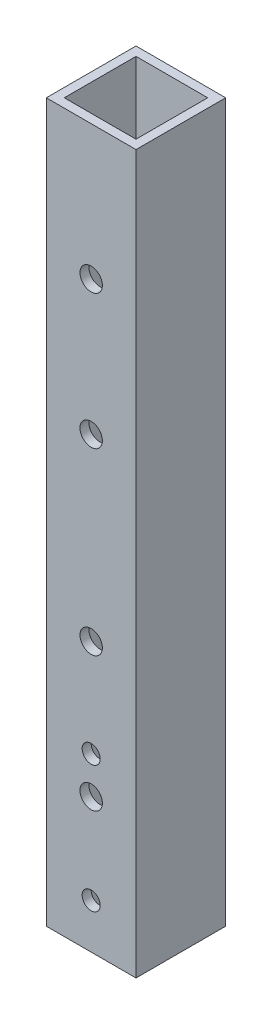
ISO-10303-21;
HEADER;
FILE_DESCRIPTION(('STEP AP214'),'2;1');
FILE_NAME('part.step','',(''),(''),'','','');
FILE_SCHEMA(('AUTOMOTIVE_DESIGN { 1 0 10303 214 1 1 1 1 }'));
ENDSEC;
DATA;
#1=APPLICATION_CONTEXT('core data for automotive mechanical design processes');
#2=APPLICATION_PROTOCOL_DEFINITION('international standard','automotive_design',2000,#1);
#3=PRODUCT_CONTEXT('',#1,'mechanical');
#4=PRODUCT('Part','Part','',(#3));
#5=PRODUCT_RELATED_PRODUCT_CATEGORY('part','',(#4));
#6=PRODUCT_DEFINITION_FORMATION('','',#4);
#7=PRODUCT_DEFINITION_CONTEXT('part definition',#1,'design');
#8=PRODUCT_DEFINITION('design','',#6,#7);
#9=PRODUCT_DEFINITION_SHAPE('','',#8);
#10=(LENGTH_UNIT() NAMED_UNIT(*) SI_UNIT(.MILLI.,.METRE.));
#11=(NAMED_UNIT(*) PLANE_ANGLE_UNIT() SI_UNIT($,.RADIAN.));
#12=(NAMED_UNIT(*) SI_UNIT($,.STERADIAN.) SOLID_ANGLE_UNIT());
#13=UNCERTAINTY_MEASURE_WITH_UNIT(LENGTH_MEASURE(1.E-05),#10,'distance_accuracy_value','');
#14=(GEOMETRIC_REPRESENTATION_CONTEXT(3) GLOBAL_UNCERTAINTY_ASSIGNED_CONTEXT((#13)) GLOBAL_UNIT_ASSIGNED_CONTEXT((#10,
#11,#12)) REPRESENTATION_CONTEXT('',''));
#15=CARTESIAN_POINT('',(0.,0.,0.));
#16=DIRECTION('',(0.,0.,1.));
#17=DIRECTION('',(1.,0.,0.));
#18=AXIS2_PLACEMENT_3D('',#15,#16,#17);
#19=CARTESIAN_POINT('',(0.,101.6,0.));
#20=DIRECTION('',(0.,1.,0.));
#21=DIRECTION('',(0.,0.,1.));
#22=AXIS2_PLACEMENT_3D('',#19,#20,#21);
#23=PLANE('',#22);
#24=DIRECTION('',(0.,0.,-1.));
#25=VECTOR('',#24,1.);
#26=CARTESIAN_POINT('',(12.7,101.6,-12.7));
#27=LINE('',#26,#25);
#28=CARTESIAN_POINT('',(12.7,101.6,12.7));
#29=VERTEX_POINT('',#28);
#30=CARTESIAN_POINT('',(12.7,101.6,-12.7));
#31=VERTEX_POINT('',#30);
#32=EDGE_CURVE('E160',#29,#31,#27,.T.);
#33=ORIENTED_EDGE('',*,*,#32,.T.);
#34=DIRECTION('',(-1.,0.,0.));
#35=VECTOR('',#34,1.);
#36=CARTESIAN_POINT('',(-12.7,101.6,-12.7));
#37=LINE('',#36,#35);
#38=CARTESIAN_POINT('',(-12.7,101.6,-12.7));
#39=VERTEX_POINT('',#38);
#40=EDGE_CURVE('E164',#31,#39,#37,.T.);
#41=ORIENTED_EDGE('',*,*,#40,.T.);
#42=DIRECTION('',(0.,0.,1.));
#43=VECTOR('',#42,1.);
#44=CARTESIAN_POINT('',(-12.7,101.6,-12.7));
#45=LINE('',#44,#43);
#46=CARTESIAN_POINT('',(-12.7,101.6,12.7));
#47=VERTEX_POINT('',#46);
#48=EDGE_CURVE('E168',#39,#47,#45,.T.);
#49=ORIENTED_EDGE('',*,*,#48,.T.);
#50=DIRECTION('',(1.,0.,0.));
#51=VECTOR('',#50,1.);
#52=CARTESIAN_POINT('',(-12.7,101.6,12.7));
#53=LINE('',#52,#51);
#54=EDGE_CURVE('E171',#47,#29,#53,.T.);
#55=ORIENTED_EDGE('',*,*,#54,.T.);
#56=EDGE_LOOP('',(#33,#41,#49,#55));
#57=FACE_BOUND('',#56,.T.);
#58=DIRECTION('',(-1.,0.,0.));
#59=VECTOR('',#58,1.);
#60=CARTESIAN_POINT('',(-10.16,101.6,-10.16));
#61=LINE('',#60,#59);
#62=CARTESIAN_POINT('',(10.16,101.6,-10.16));
#63=VERTEX_POINT('',#62);
#64=CARTESIAN_POINT('',(-10.16,101.6,-10.16));
#65=VERTEX_POINT('',#64);
#66=EDGE_CURVE('E118',#63,#65,#61,.T.);
#67=ORIENTED_EDGE('',*,*,#66,.F.);
#68=DIRECTION('',(0.,0.,-1.));
#69=VECTOR('',#68,1.);
#70=CARTESIAN_POINT('',(10.16,101.6,-10.16));
#71=LINE('',#70,#69);
#72=CARTESIAN_POINT('',(10.16,101.6,10.16));
#73=VERTEX_POINT('',#72);
#74=EDGE_CURVE('E109',#73,#63,#71,.T.);
#75=ORIENTED_EDGE('',*,*,#74,.F.);
#76=DIRECTION('',(1.,0.,0.));
#77=VECTOR('',#76,1.);
#78=CARTESIAN_POINT('',(-10.16,101.6,10.16));
#79=LINE('',#78,#77);
#80=CARTESIAN_POINT('',(-10.16,101.6,10.16));
#81=VERTEX_POINT('',#80);
#82=EDGE_CURVE('E136',#81,#73,#79,.T.);
#83=ORIENTED_EDGE('',*,*,#82,.F.);
#84=DIRECTION('',(0.,0.,1.));
#85=VECTOR('',#84,1.);
#86=CARTESIAN_POINT('',(-10.16,101.6,-10.16));
#87=LINE('',#86,#85);
#88=EDGE_CURVE('E131',#65,#81,#87,.T.);
#89=ORIENTED_EDGE('',*,*,#88,.F.);
#90=EDGE_LOOP('',(#67,#75,#83,#89));
#91=FACE_BOUND('',#90,.T.);
#92=ADVANCED_FACE('F41',(#57,#91),#23,.T.);
#93=CARTESIAN_POINT('',(0.,-101.6,0.));
#94=DIRECTION('',(0.,1.,0.));
#95=DIRECTION('',(0.,0.,1.));
#96=AXIS2_PLACEMENT_3D('',#93,#94,#95);
#97=PLANE('',#96);
#98=DIRECTION('',(0.,0.,-1.));
#99=VECTOR('',#98,1.);
#100=CARTESIAN_POINT('',(12.7,-101.6,-12.7));
#101=LINE('',#100,#99);
#102=CARTESIAN_POINT('',(12.7,-101.6,12.7));
#103=VERTEX_POINT('',#102);
#104=CARTESIAN_POINT('',(12.7,-101.6,-12.7));
#105=VERTEX_POINT('',#104);
#106=EDGE_CURVE('E127',#103,#105,#101,.T.);
#107=ORIENTED_EDGE('',*,*,#106,.F.);
#108=DIRECTION('',(1.,0.,0.));
#109=VECTOR('',#108,1.);
#110=CARTESIAN_POINT('',(-12.7,-101.6,12.7));
#111=LINE('',#110,#109);
#112=CARTESIAN_POINT('',(-12.7,-101.6,12.7));
#113=VERTEX_POINT('',#112);
#114=EDGE_CURVE('E165',#113,#103,#111,.T.);
#115=ORIENTED_EDGE('',*,*,#114,.F.);
#116=DIRECTION('',(0.,0.,1.));
#117=VECTOR('',#116,1.);
#118=CARTESIAN_POINT('',(-12.7,-101.6,-12.7));
#119=LINE('',#118,#117);
#120=CARTESIAN_POINT('',(-12.7,-101.6,-12.7));
#121=VERTEX_POINT('',#120);
#122=EDGE_CURVE('E181',#121,#113,#119,.T.);
#123=ORIENTED_EDGE('',*,*,#122,.F.);
#124=DIRECTION('',(-1.,0.,0.));
#125=VECTOR('',#124,1.);
#126=CARTESIAN_POINT('',(-12.7,-101.6,-12.7));
#127=LINE('',#126,#125);
#128=EDGE_CURVE('E178',#105,#121,#127,.T.);
#129=ORIENTED_EDGE('',*,*,#128,.F.);
#130=EDGE_LOOP('',(#107,#115,#123,#129));
#131=FACE_BOUND('',#130,.T.);
#132=DIRECTION('',(0.,0.,-1.));
#133=VECTOR('',#132,1.);
#134=CARTESIAN_POINT('',(10.16,-101.6,-10.16));
#135=LINE('',#134,#133);
#136=CARTESIAN_POINT('',(10.16,-101.6,10.16));
#137=VERTEX_POINT('',#136);
#138=CARTESIAN_POINT('',(10.16,-101.6,-10.16));
#139=VERTEX_POINT('',#138);
#140=EDGE_CURVE('E67',#137,#139,#135,.T.);
#141=ORIENTED_EDGE('',*,*,#140,.T.);
#142=DIRECTION('',(-1.,0.,0.));
#143=VECTOR('',#142,1.);
#144=CARTESIAN_POINT('',(-10.16,-101.6,-10.16));
#145=LINE('',#144,#143);
#146=CARTESIAN_POINT('',(-10.16,-101.6,-10.16));
#147=VERTEX_POINT('',#146);
#148=EDGE_CURVE('E125',#139,#147,#145,.T.);
#149=ORIENTED_EDGE('',*,*,#148,.T.);
#150=DIRECTION('',(0.,0.,1.));
#151=VECTOR('',#150,1.);
#152=CARTESIAN_POINT('',(-10.16,-101.6,-10.16));
#153=LINE('',#152,#151);
#154=CARTESIAN_POINT('',(-10.16,-101.6,10.16));
#155=VERTEX_POINT('',#154);
#156=EDGE_CURVE('E147',#147,#155,#153,.T.);
#157=ORIENTED_EDGE('',*,*,#156,.T.);
#158=DIRECTION('',(1.,0.,0.));
#159=VECTOR('',#158,1.);
#160=CARTESIAN_POINT('',(-10.16,-101.6,10.16));
#161=LINE('',#160,#159);
#162=EDGE_CURVE('E119',#155,#137,#161,.T.);
#163=ORIENTED_EDGE('',*,*,#162,.T.);
#164=EDGE_LOOP('',(#141,#149,#157,#163));
#165=FACE_BOUND('',#164,.T.);
#166=ADVANCED_FACE('F302',(#131,#165),#97,.F.);
#167=CARTESIAN_POINT('',(12.7,101.6,-12.7));
#168=DIRECTION('',(-1.,0.,0.));
#169=DIRECTION('',(0.,0.,1.));
#170=AXIS2_PLACEMENT_3D('',#167,#168,#169);
#171=PLANE('',#170);
#172=ORIENTED_EDGE('',*,*,#106,.T.);
#173=DIRECTION('',(0.,-1.,0.));
#174=VECTOR('',#173,1.);
#175=CARTESIAN_POINT('',(12.7,101.6,-12.7));
#176=LINE('',#175,#174);
#177=EDGE_CURVE('E11',#31,#105,#176,.T.);
#178=ORIENTED_EDGE('',*,*,#177,.F.);
#179=ORIENTED_EDGE('',*,*,#32,.F.);
#180=DIRECTION('',(0.,-1.,0.));
#181=VECTOR('',#180,1.);
#182=CARTESIAN_POINT('',(12.7,101.6,12.7));
#183=LINE('',#182,#181);
#184=EDGE_CURVE('E174',#29,#103,#183,.T.);
#185=ORIENTED_EDGE('',*,*,#184,.T.);
#186=EDGE_LOOP('',(#172,#178,#179,#185));
#187=FACE_BOUND('',#186,.T.);
#188=ADVANCED_FACE('F43',(#187),#171,.F.);
#189=CARTESIAN_POINT('',(-12.7,101.6,-12.7));
#190=DIRECTION('',(0.,0.,1.));
#191=DIRECTION('',(1.,0.,0.));
#192=AXIS2_PLACEMENT_3D('',#189,#190,#191);
#193=PLANE('',#192);
#194=CARTESIAN_POINT('',(0.,-52.959,-12.7));
#195=DIRECTION('',(0.,0.,-1.));
#196=DIRECTION('',(-1.,0.,0.));
#197=AXIS2_PLACEMENT_3D('',#194,#195,#196);
#198=CIRCLE('',#197,2.5527);
#199=CARTESIAN_POINT('',(-2.5527,-52.959,-12.7));
#200=VERTEX_POINT('',#199);
#201=EDGE_CURVE('E327',#200,#200,#198,.T.);
#202=ORIENTED_EDGE('',*,*,#201,.F.);
#203=EDGE_LOOP('',(#202));
#204=FACE_BOUND('',#203,.T.);
#205=CARTESIAN_POINT('',(0.,-88.9,-12.7));
#206=DIRECTION('',(0.,0.,-1.));
#207=DIRECTION('',(-1.,0.,0.));
#208=AXIS2_PLACEMENT_3D('',#205,#206,#207);
#209=CIRCLE('',#208,2.5527);
#210=CARTESIAN_POINT('',(-2.5527,-88.9,-12.7));
#211=VERTEX_POINT('',#210);
#212=EDGE_CURVE('E232',#211,#211,#209,.T.);
#213=ORIENTED_EDGE('',*,*,#212,.F.);
#214=EDGE_LOOP('',(#213));
#215=FACE_BOUND('',#214,.T.);
#216=CARTESIAN_POINT('',(0.,-25.4,-12.7));
#217=DIRECTION('',(0.,0.,1.));
#218=DIRECTION('',(1.,0.,0.));
#219=AXIS2_PLACEMENT_3D('',#216,#217,#218);
#220=CIRCLE('',#219,3.175);
#221=CARTESIAN_POINT('',(3.175,-25.4,-12.7));
#222=VERTEX_POINT('',#221);
#223=EDGE_CURVE('E217',#222,#222,#220,.T.);
#224=ORIENTED_EDGE('',*,*,#223,.T.);
#225=EDGE_LOOP('',(#224));
#226=FACE_BOUND('',#225,.T.);
#227=CARTESIAN_POINT('',(0.,25.4,-12.7));
#228=DIRECTION('',(0.,0.,1.));
#229=DIRECTION('',(1.,0.,0.));
#230=AXIS2_PLACEMENT_3D('',#227,#228,#229);
#231=CIRCLE('',#230,3.175);
#232=CARTESIAN_POINT('',(3.175,25.4,-12.7));
#233=VERTEX_POINT('',#232);
#234=EDGE_CURVE('E212',#233,#233,#231,.T.);
#235=ORIENTED_EDGE('',*,*,#234,.T.);
#236=EDGE_LOOP('',(#235));
#237=FACE_BOUND('',#236,.T.);
#238=CARTESIAN_POINT('',(0.,-63.5,-12.7));
#239=DIRECTION('',(0.,0.,1.));
#240=DIRECTION('',(1.,0.,0.));
#241=AXIS2_PLACEMENT_3D('',#238,#239,#240);
#242=CIRCLE('',#241,3.175);
#243=CARTESIAN_POINT('',(3.175,-63.5,-12.7));
#244=VERTEX_POINT('',#243);
#245=EDGE_CURVE('E206',#244,#244,#242,.T.);
#246=ORIENTED_EDGE('',*,*,#245,.T.);
#247=EDGE_LOOP('',(#246));
#248=FACE_BOUND('',#247,.T.);
#249=CARTESIAN_POINT('',(0.,63.5,-12.7));
#250=DIRECTION('',(0.,0.,1.));
#251=DIRECTION('',(1.,0.,0.));
#252=AXIS2_PLACEMENT_3D('',#249,#250,#251);
#253=CIRCLE('',#252,3.175);
#254=CARTESIAN_POINT('',(3.175,63.5,-12.7));
#255=VERTEX_POINT('',#254);
#256=EDGE_CURVE('E200',#255,#255,#253,.T.);
#257=ORIENTED_EDGE('',*,*,#256,.T.);
#258=EDGE_LOOP('',(#257));
#259=FACE_BOUND('',#258,.T.);
#260=ORIENTED_EDGE('',*,*,#128,.T.);
#261=DIRECTION('',(0.,-1.,0.));
#262=VECTOR('',#261,1.);
#263=CARTESIAN_POINT('',(-12.7,101.6,-12.7));
#264=LINE('',#263,#262);
#265=EDGE_CURVE('E51',#39,#121,#264,.T.);
#266=ORIENTED_EDGE('',*,*,#265,.F.);
#267=ORIENTED_EDGE('',*,*,#40,.F.);
#268=ORIENTED_EDGE('',*,*,#177,.T.);
#269=EDGE_LOOP('',(#260,#266,#267,#268));
#270=FACE_BOUND('',#269,.T.);
#271=ADVANCED_FACE('F316',(#204,#215,#226,#237,#248,#259,#270),#193,.F.);
#272=CARTESIAN_POINT('',(-12.7,101.6,-12.7));
#273=DIRECTION('',(1.,0.,0.));
#274=DIRECTION('',(0.,0.,-1.));
#275=AXIS2_PLACEMENT_3D('',#272,#273,#274);
#276=PLANE('',#275);
#277=ORIENTED_EDGE('',*,*,#122,.T.);
#278=DIRECTION('',(0.,-1.,0.));
#279=VECTOR('',#278,1.);
#280=CARTESIAN_POINT('',(-12.7,101.6,12.7));
#281=LINE('',#280,#279);
#282=EDGE_CURVE('E189',#47,#113,#281,.T.);
#283=ORIENTED_EDGE('',*,*,#282,.F.);
#284=ORIENTED_EDGE('',*,*,#48,.F.);
#285=ORIENTED_EDGE('',*,*,#265,.T.);
#286=EDGE_LOOP('',(#277,#283,#284,#285));
#287=FACE_BOUND('',#286,.T.);
#288=ADVANCED_FACE('F313',(#287),#276,.F.);
#289=CARTESIAN_POINT('',(-12.7,101.6,12.7));
#290=DIRECTION('',(0.,0.,-1.));
#291=DIRECTION('',(-1.,0.,0.));
#292=AXIS2_PLACEMENT_3D('',#289,#290,#291);
#293=PLANE('',#292);
#294=CARTESIAN_POINT('',(0.,-52.959,12.7));
#295=DIRECTION('',(0.,0.,-1.));
#296=DIRECTION('',(-1.,0.,0.));
#297=AXIS2_PLACEMENT_3D('',#294,#295,#296);
#298=CIRCLE('',#297,2.5527);
#299=CARTESIAN_POINT('',(-2.5527,-52.959,12.7));
#300=VERTEX_POINT('',#299);
#301=EDGE_CURVE('E396',#300,#300,#298,.T.);
#302=ORIENTED_EDGE('',*,*,#301,.T.);
#303=EDGE_LOOP('',(#302));
#304=FACE_BOUND('',#303,.T.);
#305=CARTESIAN_POINT('',(0.,-88.9,12.7));
#306=DIRECTION('',(0.,0.,-1.));
#307=DIRECTION('',(-1.,0.,0.));
#308=AXIS2_PLACEMENT_3D('',#305,#306,#307);
#309=CIRCLE('',#308,2.5527);
#310=CARTESIAN_POINT('',(-2.5527,-88.9,12.7));
#311=VERTEX_POINT('',#310);
#312=EDGE_CURVE('E222',#311,#311,#309,.T.);
#313=ORIENTED_EDGE('',*,*,#312,.T.);
#314=EDGE_LOOP('',(#313));
#315=FACE_BOUND('',#314,.T.);
#316=CARTESIAN_POINT('',(0.,-25.4,12.7));
#317=DIRECTION('',(0.,0.,1.));
#318=DIRECTION('',(1.,0.,0.));
#319=AXIS2_PLACEMENT_3D('',#316,#317,#318);
#320=CIRCLE('',#319,3.175);
#321=CARTESIAN_POINT('',(3.175,-25.4,12.7));
#322=VERTEX_POINT('',#321);
#323=EDGE_CURVE('E229',#322,#322,#320,.T.);
#324=ORIENTED_EDGE('',*,*,#323,.F.);
#325=EDGE_LOOP('',(#324));
#326=FACE_BOUND('',#325,.T.);
#327=CARTESIAN_POINT('',(0.,25.4,12.7));
#328=DIRECTION('',(0.,0.,1.));
#329=DIRECTION('',(1.,0.,0.));
#330=AXIS2_PLACEMENT_3D('',#327,#328,#329);
#331=CIRCLE('',#330,3.175);
#332=CARTESIAN_POINT('',(3.175,25.4,12.7));
#333=VERTEX_POINT('',#332);
#334=EDGE_CURVE('E252',#333,#333,#331,.T.);
#335=ORIENTED_EDGE('',*,*,#334,.F.);
#336=EDGE_LOOP('',(#335));
#337=FACE_BOUND('',#336,.T.);
#338=CARTESIAN_POINT('',(0.,-63.5,12.7));
#339=DIRECTION('',(0.,0.,1.));
#340=DIRECTION('',(1.,0.,0.));
#341=AXIS2_PLACEMENT_3D('',#338,#339,#340);
#342=CIRCLE('',#341,3.175);
#343=CARTESIAN_POINT('',(3.175,-63.5,12.7));
#344=VERTEX_POINT('',#343);
#345=EDGE_CURVE('E262',#344,#344,#342,.T.);
#346=ORIENTED_EDGE('',*,*,#345,.F.);
#347=EDGE_LOOP('',(#346));
#348=FACE_BOUND('',#347,.T.);
#349=CARTESIAN_POINT('',(0.,63.5,12.7));
#350=DIRECTION('',(0.,0.,1.));
#351=DIRECTION('',(1.,0.,0.));
#352=AXIS2_PLACEMENT_3D('',#349,#350,#351);
#353=CIRCLE('',#352,3.175);
#354=CARTESIAN_POINT('',(3.175,63.5,12.7));
#355=VERTEX_POINT('',#354);
#356=EDGE_CURVE('E272',#355,#355,#353,.T.);
#357=ORIENTED_EDGE('',*,*,#356,.F.);
#358=EDGE_LOOP('',(#357));
#359=FACE_BOUND('',#358,.T.);
#360=ORIENTED_EDGE('',*,*,#114,.T.);
#361=ORIENTED_EDGE('',*,*,#184,.F.);
#362=ORIENTED_EDGE('',*,*,#54,.F.);
#363=ORIENTED_EDGE('',*,*,#282,.T.);
#364=EDGE_LOOP('',(#360,#361,#362,#363));
#365=FACE_BOUND('',#364,.T.);
#366=ADVANCED_FACE('F297',(#304,#315,#326,#337,#348,#359,#365),#293,.F.);
#367=CARTESIAN_POINT('',(10.16,101.6,-10.16));
#368=DIRECTION('',(-1.,0.,0.));
#369=DIRECTION('',(0.,0.,1.));
#370=AXIS2_PLACEMENT_3D('',#367,#368,#369);
#371=PLANE('',#370);
#372=ORIENTED_EDGE('',*,*,#140,.F.);
#373=DIRECTION('',(0.,-1.,0.));
#374=VECTOR('',#373,1.);
#375=CARTESIAN_POINT('',(10.16,101.6,10.16));
#376=LINE('',#375,#374);
#377=EDGE_CURVE('E113',#73,#137,#376,.T.);
#378=ORIENTED_EDGE('',*,*,#377,.F.);
#379=ORIENTED_EDGE('',*,*,#74,.T.);
#380=DIRECTION('',(0.,-1.,0.));
#381=VECTOR('',#380,1.);
#382=CARTESIAN_POINT('',(10.16,101.6,-10.16));
#383=LINE('',#382,#381);
#384=EDGE_CURVE('E112',#63,#139,#383,.T.);
#385=ORIENTED_EDGE('',*,*,#384,.T.);
#386=EDGE_LOOP('',(#372,#378,#379,#385));
#387=FACE_BOUND('',#386,.T.);
#388=ADVANCED_FACE('F111',(#387),#371,.T.);
#389=CARTESIAN_POINT('',(-10.16,101.6,-10.16));
#390=DIRECTION('',(0.,0.,1.));
#391=DIRECTION('',(1.,0.,0.));
#392=AXIS2_PLACEMENT_3D('',#389,#390,#391);
#393=PLANE('',#392);
#394=CARTESIAN_POINT('',(0.,-52.959,-10.16));
#395=DIRECTION('',(0.,0.,1.));
#396=DIRECTION('',(1.,0.,0.));
#397=AXIS2_PLACEMENT_3D('',#394,#395,#396);
#398=CIRCLE('',#397,2.5527);
#399=CARTESIAN_POINT('',(2.5527,-52.959,-10.16));
#400=VERTEX_POINT('',#399);
#401=EDGE_CURVE('E239',#400,#400,#398,.T.);
#402=ORIENTED_EDGE('',*,*,#401,.F.);
#403=EDGE_LOOP('',(#402));
#404=FACE_BOUND('',#403,.T.);
#405=CARTESIAN_POINT('',(0.,-88.9,-10.16));
#406=DIRECTION('',(0.,0.,1.));
#407=DIRECTION('',(1.,0.,0.));
#408=AXIS2_PLACEMENT_3D('',#405,#406,#407);
#409=CIRCLE('',#408,2.5527);
#410=CARTESIAN_POINT('',(2.5527,-88.9,-10.16));
#411=VERTEX_POINT('',#410);
#412=EDGE_CURVE('E221',#411,#411,#409,.T.);
#413=ORIENTED_EDGE('',*,*,#412,.F.);
#414=EDGE_LOOP('',(#413));
#415=FACE_BOUND('',#414,.T.);
#416=CARTESIAN_POINT('',(0.,-25.4,-10.16));
#417=DIRECTION('',(0.,0.,1.));
#418=DIRECTION('',(1.,0.,0.));
#419=AXIS2_PLACEMENT_3D('',#416,#417,#418);
#420=CIRCLE('',#419,3.175);
#421=CARTESIAN_POINT('',(3.175,-25.4,-10.16));
#422=VERTEX_POINT('',#421);
#423=EDGE_CURVE('E216',#422,#422,#420,.T.);
#424=ORIENTED_EDGE('',*,*,#423,.F.);
#425=EDGE_LOOP('',(#424));
#426=FACE_BOUND('',#425,.T.);
#427=CARTESIAN_POINT('',(0.,25.4,-10.16));
#428=DIRECTION('',(0.,0.,1.));
#429=DIRECTION('',(1.,0.,0.));
#430=AXIS2_PLACEMENT_3D('',#427,#428,#429);
#431=CIRCLE('',#430,3.175);
#432=CARTESIAN_POINT('',(3.175,25.4,-10.16));
#433=VERTEX_POINT('',#432);
#434=EDGE_CURVE('E211',#433,#433,#431,.T.);
#435=ORIENTED_EDGE('',*,*,#434,.F.);
#436=EDGE_LOOP('',(#435));
#437=FACE_BOUND('',#436,.T.);
#438=CARTESIAN_POINT('',(0.,-63.5,-10.16));
#439=DIRECTION('',(0.,0.,1.));
#440=DIRECTION('',(1.,0.,0.));
#441=AXIS2_PLACEMENT_3D('',#438,#439,#440);
#442=CIRCLE('',#441,3.175);
#443=CARTESIAN_POINT('',(3.175,-63.5,-10.16));
#444=VERTEX_POINT('',#443);
#445=EDGE_CURVE('E205',#444,#444,#442,.T.);
#446=ORIENTED_EDGE('',*,*,#445,.F.);
#447=EDGE_LOOP('',(#446));
#448=FACE_BOUND('',#447,.T.);
#449=CARTESIAN_POINT('',(0.,63.5,-10.16));
#450=DIRECTION('',(0.,0.,1.));
#451=DIRECTION('',(1.,0.,0.));
#452=AXIS2_PLACEMENT_3D('',#449,#450,#451);
#453=CIRCLE('',#452,3.175);
#454=CARTESIAN_POINT('',(3.175,63.5,-10.16));
#455=VERTEX_POINT('',#454);
#456=EDGE_CURVE('E144',#455,#455,#453,.T.);
#457=ORIENTED_EDGE('',*,*,#456,.F.);
#458=EDGE_LOOP('',(#457));
#459=FACE_BOUND('',#458,.T.);
#460=ORIENTED_EDGE('',*,*,#148,.F.);
#461=ORIENTED_EDGE('',*,*,#384,.F.);
#462=ORIENTED_EDGE('',*,*,#66,.T.);
#463=DIRECTION('',(0.,-1.,0.));
#464=VECTOR('',#463,1.);
#465=CARTESIAN_POINT('',(-10.16,101.6,-10.16));
#466=LINE('',#465,#464);
#467=EDGE_CURVE('E128',#65,#147,#466,.T.);
#468=ORIENTED_EDGE('',*,*,#467,.T.);
#469=EDGE_LOOP('',(#460,#461,#462,#468));
#470=FACE_BOUND('',#469,.T.);
#471=ADVANCED_FACE('F122',(#404,#415,#426,#437,#448,#459,#470),#393,.T.);
#472=CARTESIAN_POINT('',(-10.16,101.6,-10.16));
#473=DIRECTION('',(1.,0.,0.));
#474=DIRECTION('',(0.,0.,-1.));
#475=AXIS2_PLACEMENT_3D('',#472,#473,#474);
#476=PLANE('',#475);
#477=ORIENTED_EDGE('',*,*,#156,.F.);
#478=ORIENTED_EDGE('',*,*,#467,.F.);
#479=ORIENTED_EDGE('',*,*,#88,.T.);
#480=DIRECTION('',(0.,-1.,0.));
#481=VECTOR('',#480,1.);
#482=CARTESIAN_POINT('',(-10.16,101.6,10.16));
#483=LINE('',#482,#481);
#484=EDGE_CURVE('E59',#81,#155,#483,.T.);
#485=ORIENTED_EDGE('',*,*,#484,.T.);
#486=EDGE_LOOP('',(#477,#478,#479,#485));
#487=FACE_BOUND('',#486,.T.);
#488=ADVANCED_FACE('F287',(#487),#476,.T.);
#489=CARTESIAN_POINT('',(-10.16,101.6,10.16));
#490=DIRECTION('',(0.,0.,-1.));
#491=DIRECTION('',(-1.,0.,0.));
#492=AXIS2_PLACEMENT_3D('',#489,#490,#491);
#493=PLANE('',#492);
#494=CARTESIAN_POINT('',(0.,-52.959,10.16));
#495=DIRECTION('',(0.,0.,-1.));
#496=DIRECTION('',(-1.,0.,0.));
#497=AXIS2_PLACEMENT_3D('',#494,#495,#496);
#498=CIRCLE('',#497,2.5527);
#499=CARTESIAN_POINT('',(-2.5527,-52.959,10.16));
#500=VERTEX_POINT('',#499);
#501=EDGE_CURVE('E45',#500,#500,#498,.T.);
#502=ORIENTED_EDGE('',*,*,#501,.F.);
#503=EDGE_LOOP('',(#502));
#504=FACE_BOUND('',#503,.T.);
#505=CARTESIAN_POINT('',(0.,-88.9,10.16));
#506=DIRECTION('',(0.,0.,-1.));
#507=DIRECTION('',(-1.,0.,0.));
#508=AXIS2_PLACEMENT_3D('',#505,#506,#507);
#509=CIRCLE('',#508,2.5527);
#510=CARTESIAN_POINT('',(-2.5527,-88.9,10.16));
#511=VERTEX_POINT('',#510);
#512=EDGE_CURVE('E218',#511,#511,#509,.T.);
#513=ORIENTED_EDGE('',*,*,#512,.F.);
#514=EDGE_LOOP('',(#513));
#515=FACE_BOUND('',#514,.T.);
#516=CARTESIAN_POINT('',(0.,-25.4,10.16));
#517=DIRECTION('',(0.,0.,-1.));
#518=DIRECTION('',(-1.,0.,0.));
#519=AXIS2_PLACEMENT_3D('',#516,#517,#518);
#520=CIRCLE('',#519,3.175);
#521=CARTESIAN_POINT('',(-3.175,-25.4,10.16));
#522=VERTEX_POINT('',#521);
#523=EDGE_CURVE('E213',#522,#522,#520,.T.);
#524=ORIENTED_EDGE('',*,*,#523,.F.);
#525=EDGE_LOOP('',(#524));
#526=FACE_BOUND('',#525,.T.);
#527=CARTESIAN_POINT('',(0.,25.4,10.16));
#528=DIRECTION('',(0.,0.,-1.));
#529=DIRECTION('',(-1.,0.,0.));
#530=AXIS2_PLACEMENT_3D('',#527,#528,#529);
#531=CIRCLE('',#530,3.175);
#532=CARTESIAN_POINT('',(-3.175,25.4,10.16));
#533=VERTEX_POINT('',#532);
#534=EDGE_CURVE('E207',#533,#533,#531,.T.);
#535=ORIENTED_EDGE('',*,*,#534,.F.);
#536=EDGE_LOOP('',(#535));
#537=FACE_BOUND('',#536,.T.);
#538=CARTESIAN_POINT('',(0.,-63.5,10.16));
#539=DIRECTION('',(0.,0.,-1.));
#540=DIRECTION('',(-1.,0.,0.));
#541=AXIS2_PLACEMENT_3D('',#538,#539,#540);
#542=CIRCLE('',#541,3.175);
#543=CARTESIAN_POINT('',(-3.175,-63.5,10.16));
#544=VERTEX_POINT('',#543);
#545=EDGE_CURVE('E201',#544,#544,#542,.T.);
#546=ORIENTED_EDGE('',*,*,#545,.F.);
#547=EDGE_LOOP('',(#546));
#548=FACE_BOUND('',#547,.T.);
#549=CARTESIAN_POINT('',(0.,63.5,10.16));
#550=DIRECTION('',(0.,0.,-1.));
#551=DIRECTION('',(-1.,0.,0.));
#552=AXIS2_PLACEMENT_3D('',#549,#550,#551);
#553=CIRCLE('',#552,3.175);
#554=CARTESIAN_POINT('',(-3.175,63.5,10.16));
#555=VERTEX_POINT('',#554);
#556=EDGE_CURVE('E196',#555,#555,#553,.T.);
#557=ORIENTED_EDGE('',*,*,#556,.F.);
#558=EDGE_LOOP('',(#557));
#559=FACE_BOUND('',#558,.T.);
#560=ORIENTED_EDGE('',*,*,#162,.F.);
#561=ORIENTED_EDGE('',*,*,#484,.F.);
#562=ORIENTED_EDGE('',*,*,#82,.T.);
#563=ORIENTED_EDGE('',*,*,#377,.T.);
#564=EDGE_LOOP('',(#560,#561,#562,#563));
#565=FACE_BOUND('',#564,.T.);
#566=ADVANCED_FACE('F294',(#504,#515,#526,#537,#548,#559,#565),#493,.T.);
#567=CARTESIAN_POINT('',(0.,63.5,-12.7));
#568=DIRECTION('',(0.,0.,1.));
#569=DIRECTION('',(1.,0.,0.));
#570=AXIS2_PLACEMENT_3D('',#567,#568,#569);
#571=CYLINDRICAL_SURFACE('',#570,3.175);
#572=ORIENTED_EDGE('',*,*,#556,.T.);
#573=EDGE_LOOP('',(#572));
#574=FACE_BOUND('',#573,.T.);
#575=ORIENTED_EDGE('',*,*,#356,.T.);
#576=EDGE_LOOP('',(#575));
#577=FACE_BOUND('',#576,.T.);
#578=ADVANCED_FACE('F352',(#574,#577),#571,.F.);
#579=ORIENTED_EDGE('',*,*,#456,.T.);
#580=EDGE_LOOP('',(#579));
#581=FACE_BOUND('',#580,.T.);
#582=ORIENTED_EDGE('',*,*,#256,.F.);
#583=EDGE_LOOP('',(#582));
#584=FACE_BOUND('',#583,.T.);
#585=ADVANCED_FACE('F283',(#581,#584),#571,.F.);
#586=CARTESIAN_POINT('',(0.,-63.5,-12.7));
#587=DIRECTION('',(0.,0.,1.));
#588=DIRECTION('',(1.,0.,0.));
#589=AXIS2_PLACEMENT_3D('',#586,#587,#588);
#590=CYLINDRICAL_SURFACE('',#589,3.175);
#591=ORIENTED_EDGE('',*,*,#545,.T.);
#592=EDGE_LOOP('',(#591));
#593=FACE_BOUND('',#592,.T.);
#594=ORIENTED_EDGE('',*,*,#345,.T.);
#595=EDGE_LOOP('',(#594));
#596=FACE_BOUND('',#595,.T.);
#597=ADVANCED_FACE('F363',(#593,#596),#590,.F.);
#598=ORIENTED_EDGE('',*,*,#445,.T.);
#599=EDGE_LOOP('',(#598));
#600=FACE_BOUND('',#599,.T.);
#601=ORIENTED_EDGE('',*,*,#245,.F.);
#602=EDGE_LOOP('',(#601));
#603=FACE_BOUND('',#602,.T.);
#604=ADVANCED_FACE('F366',(#600,#603),#590,.F.);
#605=CARTESIAN_POINT('',(0.,25.4,-12.7));
#606=DIRECTION('',(0.,0.,1.));
#607=DIRECTION('',(1.,0.,0.));
#608=AXIS2_PLACEMENT_3D('',#605,#606,#607);
#609=CYLINDRICAL_SURFACE('',#608,3.175);
#610=ORIENTED_EDGE('',*,*,#534,.T.);
#611=EDGE_LOOP('',(#610));
#612=FACE_BOUND('',#611,.T.);
#613=ORIENTED_EDGE('',*,*,#334,.T.);
#614=EDGE_LOOP('',(#613));
#615=FACE_BOUND('',#614,.T.);
#616=ADVANCED_FACE('F368',(#612,#615),#609,.F.);
#617=ORIENTED_EDGE('',*,*,#434,.T.);
#618=EDGE_LOOP('',(#617));
#619=FACE_BOUND('',#618,.T.);
#620=ORIENTED_EDGE('',*,*,#234,.F.);
#621=EDGE_LOOP('',(#620));
#622=FACE_BOUND('',#621,.T.);
#623=ADVANCED_FACE('F371',(#619,#622),#609,.F.);
#624=CARTESIAN_POINT('',(0.,-25.4,-12.7));
#625=DIRECTION('',(0.,0.,1.));
#626=DIRECTION('',(1.,0.,0.));
#627=AXIS2_PLACEMENT_3D('',#624,#625,#626);
#628=CYLINDRICAL_SURFACE('',#627,3.175);
#629=ORIENTED_EDGE('',*,*,#523,.T.);
#630=EDGE_LOOP('',(#629));
#631=FACE_BOUND('',#630,.T.);
#632=ORIENTED_EDGE('',*,*,#323,.T.);
#633=EDGE_LOOP('',(#632));
#634=FACE_BOUND('',#633,.T.);
#635=ADVANCED_FACE('F373',(#631,#634),#628,.F.);
#636=ORIENTED_EDGE('',*,*,#423,.T.);
#637=EDGE_LOOP('',(#636));
#638=FACE_BOUND('',#637,.T.);
#639=ORIENTED_EDGE('',*,*,#223,.F.);
#640=EDGE_LOOP('',(#639));
#641=FACE_BOUND('',#640,.T.);
#642=ADVANCED_FACE('F376',(#638,#641),#628,.F.);
#643=CARTESIAN_POINT('',(0.,-88.9,-12.7));
#644=DIRECTION('',(0.,0.,-1.));
#645=DIRECTION('',(-1.,0.,0.));
#646=AXIS2_PLACEMENT_3D('',#643,#644,#645);
#647=CYLINDRICAL_SURFACE('',#646,2.5527);
#648=ORIENTED_EDGE('',*,*,#512,.T.);
#649=EDGE_LOOP('',(#648));
#650=FACE_BOUND('',#649,.T.);
#651=ORIENTED_EDGE('',*,*,#312,.F.);
#652=EDGE_LOOP('',(#651));
#653=FACE_BOUND('',#652,.T.);
#654=ADVANCED_FACE('F378',(#650,#653),#647,.F.);
#655=ORIENTED_EDGE('',*,*,#412,.T.);
#656=EDGE_LOOP('',(#655));
#657=FACE_BOUND('',#656,.T.);
#658=ORIENTED_EDGE('',*,*,#212,.T.);
#659=EDGE_LOOP('',(#658));
#660=FACE_BOUND('',#659,.T.);
#661=ADVANCED_FACE('F381',(#657,#660),#647,.F.);
#662=CARTESIAN_POINT('',(0.,-52.959,-12.7));
#663=DIRECTION('',(0.,0.,-1.));
#664=DIRECTION('',(-1.,0.,0.));
#665=AXIS2_PLACEMENT_3D('',#662,#663,#664);
#666=CYLINDRICAL_SURFACE('',#665,2.5527);
#667=ORIENTED_EDGE('',*,*,#501,.T.);
#668=EDGE_LOOP('',(#667));
#669=FACE_BOUND('',#668,.T.);
#670=ORIENTED_EDGE('',*,*,#301,.F.);
#671=EDGE_LOOP('',(#670));
#672=FACE_BOUND('',#671,.T.);
#673=ADVANCED_FACE('F382',(#669,#672),#666,.F.);
#674=ORIENTED_EDGE('',*,*,#401,.T.);
#675=EDGE_LOOP('',(#674));
#676=FACE_BOUND('',#675,.T.);
#677=ORIENTED_EDGE('',*,*,#201,.T.);
#678=EDGE_LOOP('',(#677));
#679=FACE_BOUND('',#678,.T.);
#680=ADVANCED_FACE('F384',(#676,#679),#666,.F.);
#681=CLOSED_SHELL('',(#92,#166,#188,#271,#288,#366,#388,#471,#488,#566,#578,#585,#597,#604,#616,
#623,#635,#642,#654,#661,#673,#680));
#682=MANIFOLD_SOLID_BREP('B2',#681);
#683=ADVANCED_BREP_SHAPE_REPRESENTATION('',(#18,#682),#14);
#684=SHAPE_DEFINITION_REPRESENTATION(#9,#683);
ENDSEC;
END-ISO-10303-21;
